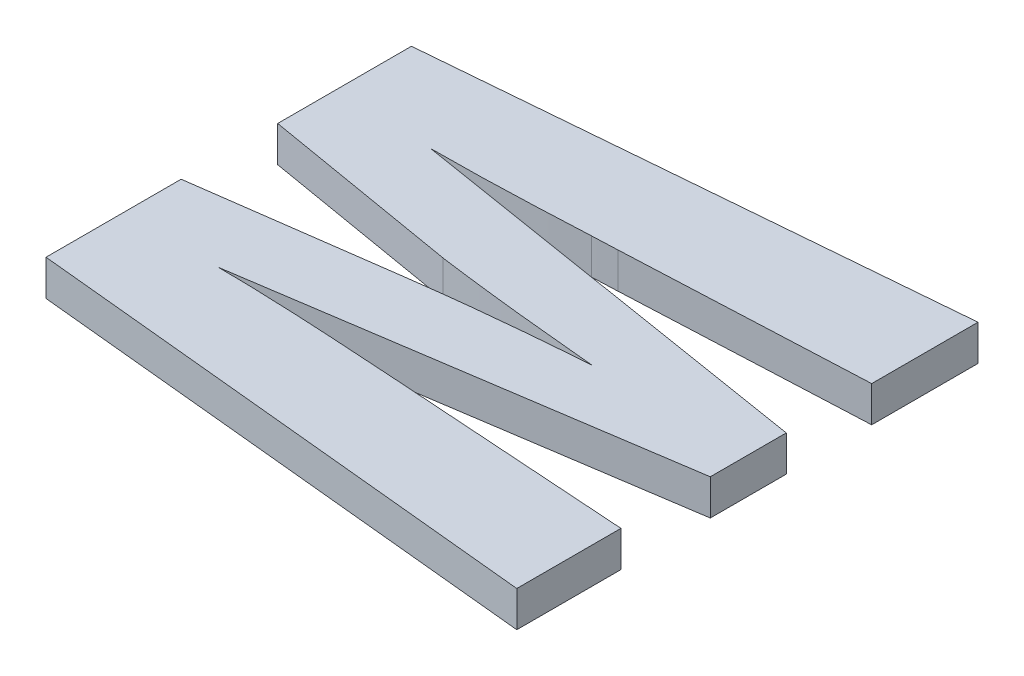
ISO-10303-21;
HEADER;
FILE_DESCRIPTION(('STEP AP214'),'2;1');
FILE_NAME('part.step','',(''),(''),'','','');
FILE_SCHEMA(('AUTOMOTIVE_DESIGN { 1 0 10303 214 1 1 1 1 }'));
ENDSEC;
DATA;
#1=APPLICATION_CONTEXT('core data for automotive mechanical design processes');
#2=APPLICATION_PROTOCOL_DEFINITION('international standard','automotive_design',2000,#1);
#3=PRODUCT_CONTEXT('',#1,'mechanical');
#4=PRODUCT('Part','Part','',(#3));
#5=PRODUCT_RELATED_PRODUCT_CATEGORY('part','',(#4));
#6=PRODUCT_DEFINITION_FORMATION('','',#4);
#7=PRODUCT_DEFINITION_CONTEXT('part definition',#1,'design');
#8=PRODUCT_DEFINITION('design','',#6,#7);
#9=PRODUCT_DEFINITION_SHAPE('','',#8);
#10=(LENGTH_UNIT() NAMED_UNIT(*) SI_UNIT(.MILLI.,.METRE.));
#11=(NAMED_UNIT(*) PLANE_ANGLE_UNIT() SI_UNIT($,.RADIAN.));
#12=(NAMED_UNIT(*) SI_UNIT($,.STERADIAN.) SOLID_ANGLE_UNIT());
#13=UNCERTAINTY_MEASURE_WITH_UNIT(LENGTH_MEASURE(1.E-05),#10,'distance_accuracy_value','');
#14=(GEOMETRIC_REPRESENTATION_CONTEXT(3) GLOBAL_UNCERTAINTY_ASSIGNED_CONTEXT((#13)) GLOBAL_UNIT_ASSIGNED_CONTEXT((#10,
#11,#12)) REPRESENTATION_CONTEXT('',''));
#15=CARTESIAN_POINT('',(0.,0.,0.));
#16=DIRECTION('',(0.,0.,1.));
#17=DIRECTION('',(1.,0.,0.));
#18=AXIS2_PLACEMENT_3D('',#15,#16,#17);
#19=CARTESIAN_POINT('',(2.55,2.9956,-0.67430397727273));
#20=DIRECTION('',(1.,0.,0.));
#21=DIRECTION('',(0.,-1.,0.));
#22=AXIS2_PLACEMENT_3D('',#19,#20,#21);
#23=PLANE('',#22);
#24=DIRECTION('',(0.,0.,1.));
#25=VECTOR('',#24,1.);
#26=CARTESIAN_POINT('',(2.55,2.9306,-0.67430397727273));
#27=LINE('',#26,#25);
#28=CARTESIAN_POINT('',(2.55,2.9306,-0.67430397727273));
#29=VERTEX_POINT('',#28);
#30=CARTESIAN_POINT('',(2.55,2.9306,-0.484805194805197));
#31=VERTEX_POINT('',#30);
#32=EDGE_CURVE('E11',#29,#31,#27,.T.);
#33=ORIENTED_EDGE('',*,*,#32,.F.);
#34=DIRECTION('',(0.,-1.,0.));
#35=VECTOR('',#34,1.);
#36=CARTESIAN_POINT('',(2.55,2.9956,-0.67430397727273));
#37=LINE('',#36,#35);
#38=CARTESIAN_POINT('',(2.55,2.9956,-0.67430397727273));
#39=VERTEX_POINT('',#38);
#40=EDGE_CURVE('E24',#39,#29,#37,.T.);
#41=ORIENTED_EDGE('',*,*,#40,.F.);
#42=DIRECTION('',(0.,0.,1.));
#43=VECTOR('',#42,1.);
#44=CARTESIAN_POINT('',(2.55,2.9956,-0.67430397727273));
#45=LINE('',#44,#43);
#46=CARTESIAN_POINT('',(2.55,2.9956,-0.484805194805197));
#47=VERTEX_POINT('',#46);
#48=EDGE_CURVE('E374',#39,#47,#45,.T.);
#49=ORIENTED_EDGE('',*,*,#48,.T.);
#50=DIRECTION('',(0.,-1.,0.));
#51=VECTOR('',#50,1.);
#52=CARTESIAN_POINT('',(2.55,2.9956,-0.484805194805197));
#53=LINE('',#52,#51);
#54=EDGE_CURVE('E168',#47,#31,#53,.T.);
#55=ORIENTED_EDGE('',*,*,#54,.T.);
#56=EDGE_LOOP('',(#33,#41,#49,#55));
#57=FACE_BOUND('',#56,.T.);
#58=ADVANCED_FACE('F17',(#57),#23,.T.);
#59=CARTESIAN_POINT('',(2.1114346590909,2.9956,-0.703798701298704));
#60=DIRECTION('',(0.0671011714329746,0.,-0.997746176536058));
#61=DIRECTION('',(-0.997746176536058,0.,-0.0671011714329746));
#62=AXIS2_PLACEMENT_3D('',#59,#60,#61);
#63=PLANE('',#62);
#64=DIRECTION('',(0.997746176536058,0.,0.0671011714329746));
#65=VECTOR('',#64,1.);
#66=CARTESIAN_POINT('',(2.1114346590909,2.9306,-0.703798701298704));
#67=LINE('',#66,#65);
#68=CARTESIAN_POINT('',(2.1114346590909,2.9306,-0.703798701298704));
#69=VERTEX_POINT('',#68);
#70=EDGE_CURVE('E371',#69,#29,#67,.T.);
#71=ORIENTED_EDGE('',*,*,#70,.F.);
#72=DIRECTION('',(0.,-1.,0.));
#73=VECTOR('',#72,1.);
#74=CARTESIAN_POINT('',(2.1114346590909,2.9956,-0.703798701298704));
#75=LINE('',#74,#73);
#76=CARTESIAN_POINT('',(2.1114346590909,2.9956,-0.703798701298704));
#77=VERTEX_POINT('',#76);
#78=EDGE_CURVE('E368',#77,#69,#75,.T.);
#79=ORIENTED_EDGE('',*,*,#78,.F.);
#80=DIRECTION('',(0.997746176536058,0.,0.0671011714329746));
#81=VECTOR('',#80,1.);
#82=CARTESIAN_POINT('',(2.1114346590909,2.9956,-0.703798701298704));
#83=LINE('',#82,#81);
#84=EDGE_CURVE('E362',#77,#39,#83,.T.);
#85=ORIENTED_EDGE('',*,*,#84,.T.);
#86=ORIENTED_EDGE('',*,*,#40,.T.);
#87=EDGE_LOOP('',(#71,#79,#85,#86));
#88=FACE_BOUND('',#87,.T.);
#89=ADVANCED_FACE('F376',(#88),#63,.T.);
#90=CARTESIAN_POINT('',(2.0503246753247,2.9956,-0.707654220779223));
#91=CARTESIAN_POINT('',(2.0503246753247,2.9306,-0.707654220779223));
#92=CARTESIAN_POINT('',(2.0566856654104,2.9956,-0.707258651402865));
#93=CARTESIAN_POINT('',(2.0566856654104,2.9306,-0.707258651402865));
#94=CARTESIAN_POINT('',(2.0685715577482,2.9956,-0.706519506245245));
#95=CARTESIAN_POINT('',(2.0685715577482,2.9306,-0.706519506245245));
#96=CARTESIAN_POINT('',(2.0851592709975,2.9956,-0.705634886613643));
#97=CARTESIAN_POINT('',(2.0851592709975,2.9306,-0.705634886613643));
#98=CARTESIAN_POINT('',(2.0991603994439,2.9956,-0.704620922676409));
#99=CARTESIAN_POINT('',(2.0991603994439,2.9306,-0.704620922676409));
#100=CARTESIAN_POINT('',(2.1076432023254,2.9956,-0.704052681326414));
#101=CARTESIAN_POINT('',(2.1076432023254,2.9306,-0.704052681326414));
#102=CARTESIAN_POINT('',(2.1114346590909,2.9956,-0.703798701298704));
#103=CARTESIAN_POINT('',(2.1114346590909,2.9306,-0.703798701298704));
#104=B_SPLINE_SURFACE_WITH_KNOTS('',3,1,((#90,#91),(#92,#93),(#94,#95),(#96,#97),(#98,#99),
(#100,#101),(#102,#103)),.UNSPECIFIED.,.F.,.F.,.F.,(4,1,1,1,4),(2,2),(0.,0.31225201051119,
0.583461651282309,0.813824845111571,1.),(0.,1.),.UNSPECIFIED.);
#105=CARTESIAN_POINT('',(2.0503246753247,2.9306,-0.707654220779223));
#106=CARTESIAN_POINT('',(2.0566856654104,2.9306,-0.707258651402865));
#107=CARTESIAN_POINT('',(2.0685715577482,2.9306,-0.706519506245245));
#108=CARTESIAN_POINT('',(2.0851592709975,2.9306,-0.705634886613643));
#109=CARTESIAN_POINT('',(2.0991603994439,2.9306,-0.704620922676409));
#110=CARTESIAN_POINT('',(2.1076432023254,2.9306,-0.704052681326414));
#111=CARTESIAN_POINT('',(2.1114346590909,2.9306,-0.703798701298704));
#112=B_SPLINE_CURVE_WITH_KNOTS('',3,(#105,#106,#107,#108,#109,#110,#111),.UNSPECIFIED.,.F.,.F.,
(4,1,1,1,4),(0.,0.31225201051119,0.583461651282309,0.813824845111571,1.),.UNSPECIFIED.);
#113=CARTESIAN_POINT('',(2.0503246753247,2.9306,-0.707654220779223));
#114=VERTEX_POINT('',#113);
#115=EDGE_CURVE('E357',#114,#69,#112,.T.);
#116=DIRECTION('',(0.,-1.,0.));
#117=VECTOR('',#116,1.);
#118=CARTESIAN_POINT('',(2.0503246753247,2.9956,-0.707654220779223));
#119=LINE('',#118,#117);
#120=CARTESIAN_POINT('',(2.0503246753247,2.9956,-0.707654220779223));
#121=VERTEX_POINT('',#120);
#122=EDGE_CURVE('E351',#121,#114,#119,.T.);
#123=CARTESIAN_POINT('',(2.0503246753247,2.9956,-0.707654220779223));
#124=CARTESIAN_POINT('',(2.0566856654104,2.9956,-0.707258651402865));
#125=CARTESIAN_POINT('',(2.0685715577482,2.9956,-0.706519506245245));
#126=CARTESIAN_POINT('',(2.0851592709975,2.9956,-0.705634886613643));
#127=CARTESIAN_POINT('',(2.0991603994439,2.9956,-0.704620922676409));
#128=CARTESIAN_POINT('',(2.1076432023254,2.9956,-0.704052681326414));
#129=CARTESIAN_POINT('',(2.1114346590909,2.9956,-0.703798701298704));
#130=B_SPLINE_CURVE_WITH_KNOTS('',3,(#123,#124,#125,#126,#127,#128,#129),.UNSPECIFIED.,.F.,.F.,
(4,1,1,1,4),(0.,0.31225201051119,0.583461651282309,0.813824845111571,1.),.UNSPECIFIED.);
#131=EDGE_CURVE('E343',#121,#77,#130,.T.);
#132=ORIENTED_EDGE('',*,*,#115,.F.);
#133=ORIENTED_EDGE('',*,*,#122,.F.);
#134=ORIENTED_EDGE('',*,*,#131,.T.);
#135=ORIENTED_EDGE('',*,*,#78,.T.);
#136=EDGE_LOOP('',(#132,#133,#134,#135));
#137=FACE_BOUND('',#136,.T.);
#138=ADVANCED_FACE('F380',(#137),#104,.T.);
#139=CARTESIAN_POINT('',(1.7731128246753,2.9956,-0.719413555194808));
#140=CARTESIAN_POINT('',(1.7731128246753,2.9306,-0.719413555194808));
#141=CARTESIAN_POINT('',(1.7816594609686,2.9956,-0.719371598065855));
#142=CARTESIAN_POINT('',(1.7816594609686,2.9306,-0.719371598065855));
#143=CARTESIAN_POINT('',(1.7995898342396,2.9956,-0.719283574315028));
#144=CARTESIAN_POINT('',(1.7995898342396,2.9306,-0.719283574315028));
#145=CARTESIAN_POINT('',(1.8277375091612,2.9956,-0.718683016275758));
#146=CARTESIAN_POINT('',(1.8277375091612,2.9306,-0.718683016275758));
#147=CARTESIAN_POINT('',(1.8584485208218,2.9956,-0.717627565305935));
#148=CARTESIAN_POINT('',(1.8584485208218,2.9306,-0.717627565305935));
#149=CARTESIAN_POINT('',(1.8918106026368,2.9956,-0.716617921873945));
#150=CARTESIAN_POINT('',(1.8918106026368,2.9306,-0.716617921873945));
#151=CARTESIAN_POINT('',(1.9277822376738,2.9956,-0.714696182107604));
#152=CARTESIAN_POINT('',(1.9277822376738,2.9306,-0.714696182107604));
#153=CARTESIAN_POINT('',(1.9663537889663,2.9956,-0.712942317403401));
#154=CARTESIAN_POINT('',(1.9663537889663,2.9306,-0.712942317403401));
#155=CARTESIAN_POINT('',(2.0074630955872,2.9956,-0.710267471488408));
#156=CARTESIAN_POINT('',(2.0074630955872,2.9306,-0.710267471488408));
#157=CARTESIAN_POINT('',(2.0357374184111,2.9956,-0.708543599092109));
#158=CARTESIAN_POINT('',(2.0357374184111,2.9306,-0.708543599092109));
#159=CARTESIAN_POINT('',(2.0503246753247,2.9956,-0.707654220779223));
#160=CARTESIAN_POINT('',(2.0503246753247,2.9306,-0.707654220779223));
#161=B_SPLINE_SURFACE_WITH_KNOTS('',3,1,((#139,#140),(#141,#142),(#143,#144),(#145,#146),(#147,
#148),(#149,#150),(#151,#152),(#153,#154),(#155,#156),(#157,#158),(#159,#160)),.UNSPECIFIED.,
.F.,.F.,.F.,(4,1,1,1,1,1,1,1,4),(2,2),(0.,0.0923950886621478,0.193839818528261,
0.304348582638287,0.424600528071903,0.554656105384144,0.693765722863727,0.842007955268638,1.),
(0.,1.),.UNSPECIFIED.);
#162=CARTESIAN_POINT('',(1.7731128246753,2.9306,-0.719413555194808));
#163=CARTESIAN_POINT('',(1.7816594609686,2.9306,-0.719371598065855));
#164=CARTESIAN_POINT('',(1.7995898342396,2.9306,-0.719283574315028));
#165=CARTESIAN_POINT('',(1.8277375091612,2.9306,-0.718683016275758));
#166=CARTESIAN_POINT('',(1.8584485208218,2.9306,-0.717627565305935));
#167=CARTESIAN_POINT('',(1.8918106026368,2.9306,-0.716617921873945));
#168=CARTESIAN_POINT('',(1.9277822376738,2.9306,-0.714696182107604));
#169=CARTESIAN_POINT('',(1.9663537889663,2.9306,-0.712942317403401));
#170=CARTESIAN_POINT('',(2.0074630955872,2.9306,-0.710267471488408));
#171=CARTESIAN_POINT('',(2.0357374184111,2.9306,-0.708543599092109));
#172=CARTESIAN_POINT('',(2.0503246753247,2.9306,-0.707654220779223));
#173=B_SPLINE_CURVE_WITH_KNOTS('',3,(#162,#163,#164,#165,#166,#167,#168,#169,#170,#171,#172),
.UNSPECIFIED.,.F.,.F.,(4,1,1,1,1,1,1,1,4),(0.,0.0923950886621478,0.193839818528261,
0.304348582638287,0.424600528071903,0.554656105384144,0.693765722863727,0.842007955268638,1.),.UNSPECIFIED.);
#174=CARTESIAN_POINT('',(1.7731128246753,2.9306,-0.719413555194808));
#175=VERTEX_POINT('',#174);
#176=EDGE_CURVE('E338',#175,#114,#173,.T.);
#177=DIRECTION('',(0.,-1.,0.));
#178=VECTOR('',#177,1.);
#179=CARTESIAN_POINT('',(1.7731128246753,2.9956,-0.719413555194808));
#180=LINE('',#179,#178);
#181=CARTESIAN_POINT('',(1.7731128246753,2.9956,-0.719413555194808));
#182=VERTEX_POINT('',#181);
#183=EDGE_CURVE('E332',#182,#175,#180,.T.);
#184=CARTESIAN_POINT('',(1.7731128246753,2.9956,-0.719413555194808));
#185=CARTESIAN_POINT('',(1.7816594609686,2.9956,-0.719371598065855));
#186=CARTESIAN_POINT('',(1.7995898342396,2.9956,-0.719283574315028));
#187=CARTESIAN_POINT('',(1.8277375091612,2.9956,-0.718683016275758));
#188=CARTESIAN_POINT('',(1.8584485208218,2.9956,-0.717627565305935));
#189=CARTESIAN_POINT('',(1.8918106026368,2.9956,-0.716617921873945));
#190=CARTESIAN_POINT('',(1.9277822376738,2.9956,-0.714696182107604));
#191=CARTESIAN_POINT('',(1.9663537889663,2.9956,-0.712942317403401));
#192=CARTESIAN_POINT('',(2.0074630955872,2.9956,-0.710267471488408));
#193=CARTESIAN_POINT('',(2.0357374184111,2.9956,-0.708543599092109));
#194=CARTESIAN_POINT('',(2.0503246753247,2.9956,-0.707654220779223));
#195=B_SPLINE_CURVE_WITH_KNOTS('',3,(#184,#185,#186,#187,#188,#189,#190,#191,#192,#193,#194),
.UNSPECIFIED.,.F.,.F.,(4,1,1,1,1,1,1,1,4),(0.,0.0923950886621478,0.193839818528261,
0.304348582638287,0.424600528071903,0.554656105384144,0.693765722863727,0.842007955268638,1.),.UNSPECIFIED.);
#196=EDGE_CURVE('E327',#182,#121,#195,.T.);
#197=ORIENTED_EDGE('',*,*,#176,.F.);
#198=ORIENTED_EDGE('',*,*,#183,.F.);
#199=ORIENTED_EDGE('',*,*,#196,.T.);
#200=ORIENTED_EDGE('',*,*,#122,.T.);
#201=EDGE_LOOP('',(#197,#198,#199,#200));
#202=FACE_BOUND('',#201,.T.);
#203=ADVANCED_FACE('F383',(#202),#161,.T.);
#204=CARTESIAN_POINT('',(2.55,2.9956,-0.836814123376626));
#205=DIRECTION('',(0.149420158974291,0.,0.988773794197691));
#206=DIRECTION('',(0.988773794197691,0.,-0.149420158974291));
#207=AXIS2_PLACEMENT_3D('',#204,#205,#206);
#208=PLANE('',#207);
#209=DIRECTION('',(-0.988773794197691,0.,0.149420158974291));
#210=VECTOR('',#209,1.);
#211=CARTESIAN_POINT('',(2.55,2.9306,-0.836814123376626));
#212=LINE('',#211,#210);
#213=CARTESIAN_POINT('',(2.55,2.9306,-0.836814123376626));
#214=VERTEX_POINT('',#213);
#215=EDGE_CURVE('E324',#214,#175,#212,.T.);
#216=ORIENTED_EDGE('',*,*,#215,.F.);
#217=DIRECTION('',(0.,-1.,0.));
#218=VECTOR('',#217,1.);
#219=CARTESIAN_POINT('',(2.55,2.9956,-0.836814123376626));
#220=LINE('',#219,#218);
#221=CARTESIAN_POINT('',(2.55,2.9956,-0.836814123376626));
#222=VERTEX_POINT('',#221);
#223=EDGE_CURVE('E321',#222,#214,#220,.T.);
#224=ORIENTED_EDGE('',*,*,#223,.F.);
#225=DIRECTION('',(-0.988773794197691,0.,0.149420158974291));
#226=VECTOR('',#225,1.);
#227=CARTESIAN_POINT('',(2.55,2.9956,-0.836814123376626));
#228=LINE('',#227,#226);
#229=EDGE_CURVE('E318',#222,#182,#228,.T.);
#230=ORIENTED_EDGE('',*,*,#229,.T.);
#231=ORIENTED_EDGE('',*,*,#183,.T.);
#232=EDGE_LOOP('',(#216,#224,#230,#231));
#233=FACE_BOUND('',#232,.T.);
#234=ADVANCED_FACE('F388',(#233),#208,.T.);
#235=CARTESIAN_POINT('',(2.55,2.9956,-0.97503449675325));
#236=DIRECTION('',(1.,0.,0.));
#237=DIRECTION('',(0.,-1.,0.));
#238=AXIS2_PLACEMENT_3D('',#235,#236,#237);
#239=PLANE('',#238);
#240=DIRECTION('',(0.,0.,1.));
#241=VECTOR('',#240,1.);
#242=CARTESIAN_POINT('',(2.55,2.9306,-0.97503449675325));
#243=LINE('',#242,#241);
#244=CARTESIAN_POINT('',(2.55,2.9306,-0.97503449675325));
#245=VERTEX_POINT('',#244);
#246=EDGE_CURVE('E315',#245,#214,#243,.T.);
#247=ORIENTED_EDGE('',*,*,#246,.F.);
#248=DIRECTION('',(0.,-1.,0.));
#249=VECTOR('',#248,1.);
#250=CARTESIAN_POINT('',(2.55,2.9956,-0.97503449675325));
#251=LINE('',#250,#249);
#252=CARTESIAN_POINT('',(2.55,2.9956,-0.97503449675325));
#253=VERTEX_POINT('',#252);
#254=EDGE_CURVE('E312',#253,#245,#251,.T.);
#255=ORIENTED_EDGE('',*,*,#254,.F.);
#256=DIRECTION('',(0.,0.,1.));
#257=VECTOR('',#256,1.);
#258=CARTESIAN_POINT('',(2.55,2.9956,-0.97503449675325));
#259=LINE('',#258,#257);
#260=EDGE_CURVE('E309',#253,#222,#259,.T.);
#261=ORIENTED_EDGE('',*,*,#260,.T.);
#262=ORIENTED_EDGE('',*,*,#223,.T.);
#263=EDGE_LOOP('',(#247,#255,#261,#262));
#264=FACE_BOUND('',#263,.T.);
#265=ADVANCED_FACE('F390',(#264),#239,.T.);
#266=CARTESIAN_POINT('',(1.778317775974,2.9956,-1.099567775974));
#267=DIRECTION('',(0.159317730379367,0.,-0.987227360230037));
#268=DIRECTION('',(-0.987227360230037,0.,-0.159317730379367));
#269=AXIS2_PLACEMENT_3D('',#266,#267,#268);
#270=PLANE('',#269);
#271=DIRECTION('',(0.987227360230037,0.,0.159317730379367));
#272=VECTOR('',#271,1.);
#273=CARTESIAN_POINT('',(1.778317775974,2.9306,-1.099567775974));
#274=LINE('',#273,#272);
#275=CARTESIAN_POINT('',(1.778317775974,2.9306,-1.099567775974));
#276=VERTEX_POINT('',#275);
#277=EDGE_CURVE('E306',#276,#245,#274,.T.);
#278=ORIENTED_EDGE('',*,*,#277,.F.);
#279=DIRECTION('',(0.,-1.,0.));
#280=VECTOR('',#279,1.);
#281=CARTESIAN_POINT('',(1.778317775974,2.9956,-1.099567775974));
#282=LINE('',#281,#280);
#283=CARTESIAN_POINT('',(1.778317775974,2.9956,-1.099567775974));
#284=VERTEX_POINT('',#283);
#285=EDGE_CURVE('E303',#284,#276,#282,.T.);
#286=ORIENTED_EDGE('',*,*,#285,.F.);
#287=DIRECTION('',(0.987227360230037,0.,0.159317730379367));
#288=VECTOR('',#287,1.);
#289=CARTESIAN_POINT('',(1.778317775974,2.9956,-1.099567775974));
#290=LINE('',#289,#288);
#291=EDGE_CURVE('E297',#284,#253,#290,.T.);
#292=ORIENTED_EDGE('',*,*,#291,.T.);
#293=ORIENTED_EDGE('',*,*,#254,.T.);
#294=EDGE_LOOP('',(#278,#286,#292,#293));
#295=FACE_BOUND('',#294,.T.);
#296=ADVANCED_FACE('F392',(#295),#270,.T.);
#297=CARTESIAN_POINT('',(2.0620840097403,2.9956,-1.1082426948052));
#298=CARTESIAN_POINT('',(2.0620840097403,2.9306,-1.1082426948052));
#299=CARTESIAN_POINT('',(2.0480123266642,2.9956,-1.1075167139611));
#300=CARTESIAN_POINT('',(2.0480123266642,2.9306,-1.1075167139611));
#301=CARTESIAN_POINT('',(2.0204518672346,2.9956,-1.1060948253715));
#302=CARTESIAN_POINT('',(2.0204518672346,2.9306,-1.1060948253715));
#303=CARTESIAN_POINT('',(1.9800967897182,2.9956,-1.1043359943212));
#304=CARTESIAN_POINT('',(1.9800967897182,2.9306,-1.1043359943212));
#305=CARTESIAN_POINT('',(1.9416604154257,2.9956,-1.1031170049683));
#306=CARTESIAN_POINT('',(1.9416604154257,2.9306,-1.1031170049683));
#307=CARTESIAN_POINT('',(1.905234836157,2.9956,-1.1016341780414));
#308=CARTESIAN_POINT('',(1.905234836157,2.9306,-1.1016341780414));
#309=CARTESIAN_POINT('',(1.8707256046615,2.9956,-1.1006747731418));
#310=CARTESIAN_POINT('',(1.8707256046615,2.9306,-1.1006747731418));
#311=CARTESIAN_POINT('',(1.8382078872173,2.9956,-1.1001423103342));
#312=CARTESIAN_POINT('',(1.8382078872173,2.9306,-1.1001423103342));
#313=CARTESIAN_POINT('',(1.8076206702007,2.9956,-1.0997252944863));
#314=CARTESIAN_POINT('',(1.8076206702007,2.9306,-1.0997252944863));
#315=CARTESIAN_POINT('',(1.7878924341285,2.9956,-1.0996192448118));
#316=CARTESIAN_POINT('',(1.7878924341285,2.9306,-1.0996192448118));
#317=CARTESIAN_POINT('',(1.778317775974,2.9956,-1.099567775974));
#318=CARTESIAN_POINT('',(1.778317775974,2.9306,-1.099567775974));
#319=B_SPLINE_SURFACE_WITH_KNOTS('',3,1,((#297,#298),(#299,#300),(#301,#302),(#303,#304),(#305,
#306),(#307,#308),(#309,#310),(#311,#312),(#313,#314),(#315,#316),(#317,#318)),.UNSPECIFIED.,
.F.,.F.,.F.,(4,1,1,1,1,1,1,1,4),(2,2),(0.,0.148880380340194,0.291593525810425,0.426790758847534,
0.555202778810434,0.676784588021821,0.791547438771983,0.898832211461524,1.),(0.,1.),.UNSPECIFIED.);
#320=CARTESIAN_POINT('',(2.0620840097403,2.9306,-1.1082426948052));
#321=CARTESIAN_POINT('',(2.0480123266642,2.9306,-1.1075167139611));
#322=CARTESIAN_POINT('',(2.0204518672346,2.9306,-1.1060948253715));
#323=CARTESIAN_POINT('',(1.9800967897182,2.9306,-1.1043359943212));
#324=CARTESIAN_POINT('',(1.9416604154257,2.9306,-1.1031170049683));
#325=CARTESIAN_POINT('',(1.905234836157,2.9306,-1.1016341780414));
#326=CARTESIAN_POINT('',(1.8707256046615,2.9306,-1.1006747731418));
#327=CARTESIAN_POINT('',(1.8382078872173,2.9306,-1.1001423103342));
#328=CARTESIAN_POINT('',(1.8076206702007,2.9306,-1.0997252944863));
#329=CARTESIAN_POINT('',(1.7878924341285,2.9306,-1.0996192448118));
#330=CARTESIAN_POINT('',(1.778317775974,2.9306,-1.099567775974));
#331=B_SPLINE_CURVE_WITH_KNOTS('',3,(#320,#321,#322,#323,#324,#325,#326,#327,#328,#329,#330),
.UNSPECIFIED.,.F.,.F.,(4,1,1,1,1,1,1,1,4),(0.,0.148880380340194,0.291593525810425,
0.426790758847534,0.555202778810434,0.676784588021821,0.791547438771983,0.898832211461524,1.),.UNSPECIFIED.);
#332=CARTESIAN_POINT('',(2.0620840097403,2.9306,-1.1082426948052));
#333=VERTEX_POINT('',#332);
#334=EDGE_CURVE('E292',#333,#276,#331,.T.);
#335=DIRECTION('',(0.,-1.,0.));
#336=VECTOR('',#335,1.);
#337=CARTESIAN_POINT('',(2.0620840097403,2.9956,-1.1082426948052));
#338=LINE('',#337,#336);
#339=CARTESIAN_POINT('',(2.0620840097403,2.9956,-1.1082426948052));
#340=VERTEX_POINT('',#339);
#341=EDGE_CURVE('E286',#340,#333,#338,.T.);
#342=CARTESIAN_POINT('',(2.0620840097403,2.9956,-1.1082426948052));
#343=CARTESIAN_POINT('',(2.0480123266642,2.9956,-1.1075167139611));
#344=CARTESIAN_POINT('',(2.0204518672346,2.9956,-1.1060948253715));
#345=CARTESIAN_POINT('',(1.9800967897182,2.9956,-1.1043359943212));
#346=CARTESIAN_POINT('',(1.9416604154257,2.9956,-1.1031170049683));
#347=CARTESIAN_POINT('',(1.905234836157,2.9956,-1.1016341780414));
#348=CARTESIAN_POINT('',(1.8707256046615,2.9956,-1.1006747731418));
#349=CARTESIAN_POINT('',(1.8382078872173,2.9956,-1.1001423103342));
#350=CARTESIAN_POINT('',(1.8076206702007,2.9956,-1.0997252944863));
#351=CARTESIAN_POINT('',(1.7878924341285,2.9956,-1.0996192448118));
#352=CARTESIAN_POINT('',(1.778317775974,2.9956,-1.099567775974));
#353=B_SPLINE_CURVE_WITH_KNOTS('',3,(#342,#343,#344,#345,#346,#347,#348,#349,#350,#351,#352),
.UNSPECIFIED.,.F.,.F.,(4,1,1,1,1,1,1,1,4),(0.,0.148880380340194,0.291593525810425,
0.426790758847534,0.555202778810434,0.676784588021821,0.791547438771983,0.898832211461524,1.),.UNSPECIFIED.);
#354=EDGE_CURVE('E278',#340,#284,#353,.T.);
#355=ORIENTED_EDGE('',*,*,#334,.F.);
#356=ORIENTED_EDGE('',*,*,#341,.F.);
#357=ORIENTED_EDGE('',*,*,#354,.T.);
#358=ORIENTED_EDGE('',*,*,#285,.T.);
#359=EDGE_LOOP('',(#355,#356,#357,#358));
#360=FACE_BOUND('',#359,.T.);
#361=ADVANCED_FACE('F395',(#360),#319,.T.);
#362=CARTESIAN_POINT('',(2.1089285714286,2.9956,-1.1101704545455));
#363=CARTESIAN_POINT('',(2.1089285714286,2.9306,-1.1101704545455));
#364=CARTESIAN_POINT('',(2.1059729528353,2.9956,-1.1100349861566));
#365=CARTESIAN_POINT('',(2.1059729528353,2.9306,-1.1100349861566));
#366=CARTESIAN_POINT('',(2.0994844443988,2.9956,-1.1097375906179));
#367=CARTESIAN_POINT('',(2.0994844443988,2.9306,-1.1097375906179));
#368=CARTESIAN_POINT('',(2.0887482072742,2.9956,-1.1094119995119));
#369=CARTESIAN_POINT('',(2.0887482072742,2.9306,-1.1094119995119));
#370=CARTESIAN_POINT('',(2.0760950157438,2.9956,-1.1087588330156));
#371=CARTESIAN_POINT('',(2.0760950157438,2.9306,-1.1087588330156));
#372=CARTESIAN_POINT('',(2.0669682057236,2.9956,-1.1084226190857));
#373=CARTESIAN_POINT('',(2.0669682057236,2.9306,-1.1084226190857));
#374=CARTESIAN_POINT('',(2.0620840097403,2.9956,-1.1082426948052));
#375=CARTESIAN_POINT('',(2.0620840097403,2.9306,-1.1082426948052));
#376=B_SPLINE_SURFACE_WITH_KNOTS('',3,1,((#362,#363),(#364,#365),(#366,#367),(#368,#369),(#370,
#371),(#372,#373),(#374,#375)),.UNSPECIFIED.,.F.,.F.,.F.,(4,1,1,1,4),(2,2),(0.,
0.189317867376636,0.415612008402144,0.687265816318514,1.),(0.,1.),.UNSPECIFIED.);
#377=CARTESIAN_POINT('',(2.1089285714286,2.9306,-1.1101704545455));
#378=CARTESIAN_POINT('',(2.1059729528353,2.9306,-1.1100349861566));
#379=CARTESIAN_POINT('',(2.0994844443988,2.9306,-1.1097375906179));
#380=CARTESIAN_POINT('',(2.0887482072742,2.9306,-1.1094119995119));
#381=CARTESIAN_POINT('',(2.0760950157438,2.9306,-1.1087588330156));
#382=CARTESIAN_POINT('',(2.0669682057236,2.9306,-1.1084226190857));
#383=CARTESIAN_POINT('',(2.0620840097403,2.9306,-1.1082426948052));
#384=B_SPLINE_CURVE_WITH_KNOTS('',3,(#377,#378,#379,#380,#381,#382,#383),.UNSPECIFIED.,.F.,.F.,
(4,1,1,1,4),(0.,0.189317867376636,0.415612008402144,0.687265816318514,1.),.UNSPECIFIED.);
#385=CARTESIAN_POINT('',(2.1089285714286,2.9306,-1.1101704545455));
#386=VERTEX_POINT('',#385);
#387=EDGE_CURVE('E273',#386,#333,#384,.T.);
#388=DIRECTION('',(0.,-1.,0.));
#389=VECTOR('',#388,1.);
#390=CARTESIAN_POINT('',(2.1089285714286,2.9956,-1.1101704545455));
#391=LINE('',#390,#389);
#392=CARTESIAN_POINT('',(2.1089285714286,2.9956,-1.1101704545455));
#393=VERTEX_POINT('',#392);
#394=EDGE_CURVE('E267',#393,#386,#391,.T.);
#395=CARTESIAN_POINT('',(2.1089285714286,2.9956,-1.1101704545455));
#396=CARTESIAN_POINT('',(2.1059729528353,2.9956,-1.1100349861566));
#397=CARTESIAN_POINT('',(2.0994844443988,2.9956,-1.1097375906179));
#398=CARTESIAN_POINT('',(2.0887482072742,2.9956,-1.1094119995119));
#399=CARTESIAN_POINT('',(2.0760950157438,2.9956,-1.1087588330156));
#400=CARTESIAN_POINT('',(2.0669682057236,2.9956,-1.1084226190857));
#401=CARTESIAN_POINT('',(2.0620840097403,2.9956,-1.1082426948052));
#402=B_SPLINE_CURVE_WITH_KNOTS('',3,(#395,#396,#397,#398,#399,#400,#401),.UNSPECIFIED.,.F.,.F.,
(4,1,1,1,4),(0.,0.189317867376636,0.415612008402144,0.687265816318514,1.),.UNSPECIFIED.);
#403=EDGE_CURVE('E262',#393,#340,#402,.T.);
#404=ORIENTED_EDGE('',*,*,#387,.F.);
#405=ORIENTED_EDGE('',*,*,#394,.F.);
#406=ORIENTED_EDGE('',*,*,#403,.T.);
#407=ORIENTED_EDGE('',*,*,#341,.T.);
#408=EDGE_LOOP('',(#404,#405,#406,#407));
#409=FACE_BOUND('',#408,.T.);
#410=ADVANCED_FACE('F400',(#409),#376,.T.);
#411=CARTESIAN_POINT('',(2.55,2.9956,-1.1304119318182));
#412=DIRECTION('',(0.0458433598132528,0.,0.99894864050212));
#413=DIRECTION('',(0.99894864050212,0.,-0.0458433598132528));
#414=AXIS2_PLACEMENT_3D('',#411,#412,#413);
#415=PLANE('',#414);
#416=DIRECTION('',(-0.99894864050212,0.,0.0458433598132528));
#417=VECTOR('',#416,1.);
#418=CARTESIAN_POINT('',(2.55,2.9306,-1.1304119318182));
#419=LINE('',#418,#417);
#420=CARTESIAN_POINT('',(2.55,2.9306,-1.1304119318182));
#421=VERTEX_POINT('',#420);
#422=EDGE_CURVE('E259',#421,#386,#419,.T.);
#423=ORIENTED_EDGE('',*,*,#422,.F.);
#424=DIRECTION('',(0.,-1.,0.));
#425=VECTOR('',#424,1.);
#426=CARTESIAN_POINT('',(2.55,2.9956,-1.1304119318182));
#427=LINE('',#426,#425);
#428=CARTESIAN_POINT('',(2.55,2.9956,-1.1304119318182));
#429=VERTEX_POINT('',#428);
#430=EDGE_CURVE('E256',#429,#421,#427,.T.);
#431=ORIENTED_EDGE('',*,*,#430,.F.);
#432=DIRECTION('',(-0.99894864050212,0.,0.0458433598132528));
#433=VECTOR('',#432,1.);
#434=CARTESIAN_POINT('',(2.55,2.9956,-1.1304119318182));
#435=LINE('',#434,#433);
#436=EDGE_CURVE('E253',#429,#393,#435,.T.);
#437=ORIENTED_EDGE('',*,*,#436,.T.);
#438=ORIENTED_EDGE('',*,*,#394,.T.);
#439=EDGE_LOOP('',(#423,#431,#437,#438));
#440=FACE_BOUND('',#439,.T.);
#441=ADVANCED_FACE('F402',(#440),#415,.T.);
#442=CARTESIAN_POINT('',(2.55,2.9956,-1.3237662337662));
#443=DIRECTION('',(1.,0.,0.));
#444=DIRECTION('',(0.,-1.,0.));
#445=AXIS2_PLACEMENT_3D('',#442,#443,#444);
#446=PLANE('',#445);
#447=DIRECTION('',(0.,0.,1.));
#448=VECTOR('',#447,1.);
#449=CARTESIAN_POINT('',(2.55,2.9306,-1.3237662337662));
#450=LINE('',#449,#448);
#451=CARTESIAN_POINT('',(2.55,2.9306,-1.3237662337662));
#452=VERTEX_POINT('',#451);
#453=EDGE_CURVE('E250',#452,#421,#450,.T.);
#454=ORIENTED_EDGE('',*,*,#453,.F.);
#455=DIRECTION('',(0.,-1.,0.));
#456=VECTOR('',#455,1.);
#457=CARTESIAN_POINT('',(2.55,2.9956,-1.3237662337662));
#458=LINE('',#457,#456);
#459=CARTESIAN_POINT('',(2.55,2.9956,-1.3237662337662));
#460=VERTEX_POINT('',#459);
#461=EDGE_CURVE('E247',#460,#452,#458,.T.);
#462=ORIENTED_EDGE('',*,*,#461,.F.);
#463=DIRECTION('',(0.,0.,1.));
#464=VECTOR('',#463,1.);
#465=CARTESIAN_POINT('',(2.55,2.9956,-1.3237662337662));
#466=LINE('',#465,#464);
#467=EDGE_CURVE('E244',#460,#429,#466,.T.);
#468=ORIENTED_EDGE('',*,*,#467,.T.);
#469=ORIENTED_EDGE('',*,*,#430,.T.);
#470=EDGE_LOOP('',(#454,#462,#468,#469));
#471=FACE_BOUND('',#470,.T.);
#472=ADVANCED_FACE('F404',(#471),#446,.T.);
#473=CARTESIAN_POINT('',(1.6,2.9956,-1.2431858766234));
#474=DIRECTION('',(-0.0845179339568708,0.,-0.996421958228371));
#475=DIRECTION('',(-0.996421958228371,0.,0.0845179339568708));
#476=AXIS2_PLACEMENT_3D('',#473,#474,#475);
#477=PLANE('',#476);
#478=DIRECTION('',(0.996421958228371,0.,-0.0845179339568709));
#479=VECTOR('',#478,1.);
#480=CARTESIAN_POINT('',(1.6,2.9306,-1.2431858766234));
#481=LINE('',#480,#479);
#482=CARTESIAN_POINT('',(1.6,2.9306,-1.2431858766234));
#483=VERTEX_POINT('',#482);
#484=EDGE_CURVE('E241',#483,#452,#481,.T.);
#485=ORIENTED_EDGE('',*,*,#484,.F.);
#486=DIRECTION('',(0.,-1.,0.));
#487=VECTOR('',#486,1.);
#488=CARTESIAN_POINT('',(1.6,2.9956,-1.2431858766234));
#489=LINE('',#488,#487);
#490=CARTESIAN_POINT('',(1.6,2.9956,-1.2431858766234));
#491=VERTEX_POINT('',#490);
#492=EDGE_CURVE('E238',#491,#483,#489,.T.);
#493=ORIENTED_EDGE('',*,*,#492,.F.);
#494=DIRECTION('',(0.996421958228371,0.,-0.0845179339568709));
#495=VECTOR('',#494,1.);
#496=CARTESIAN_POINT('',(1.6,2.9956,-1.2431858766234));
#497=LINE('',#496,#495);
#498=EDGE_CURVE('E235',#491,#460,#497,.T.);
#499=ORIENTED_EDGE('',*,*,#498,.T.);
#500=ORIENTED_EDGE('',*,*,#461,.T.);
#501=EDGE_LOOP('',(#485,#493,#499,#500));
#502=FACE_BOUND('',#501,.T.);
#503=ADVANCED_FACE('F407',(#502),#477,.T.);
#504=CARTESIAN_POINT('',(1.6,2.9956,-0.9999025974026));
#505=DIRECTION('',(-1.,0.,0.));
#506=DIRECTION('',(0.,1.,0.));
#507=AXIS2_PLACEMENT_3D('',#504,#505,#506);
#508=PLANE('',#507);
#509=DIRECTION('',(0.,0.,-1.));
#510=VECTOR('',#509,1.);
#511=CARTESIAN_POINT('',(1.6,2.9306,-0.9999025974026));
#512=LINE('',#511,#510);
#513=CARTESIAN_POINT('',(1.6,2.9306,-0.9999025974026));
#514=VERTEX_POINT('',#513);
#515=EDGE_CURVE('E232',#514,#483,#512,.T.);
#516=ORIENTED_EDGE('',*,*,#515,.F.);
#517=DIRECTION('',(0.,-1.,0.));
#518=VECTOR('',#517,1.);
#519=CARTESIAN_POINT('',(1.6,2.9956,-0.9999025974026));
#520=LINE('',#519,#518);
#521=CARTESIAN_POINT('',(1.6,2.9956,-0.9999025974026));
#522=VERTEX_POINT('',#521);
#523=EDGE_CURVE('E229',#522,#514,#520,.T.);
#524=ORIENTED_EDGE('',*,*,#523,.F.);
#525=DIRECTION('',(0.,0.,-1.));
#526=VECTOR('',#525,1.);
#527=CARTESIAN_POINT('',(1.6,2.9956,-0.9999025974026));
#528=LINE('',#527,#526);
#529=EDGE_CURVE('E226',#522,#491,#528,.T.);
#530=ORIENTED_EDGE('',*,*,#529,.T.);
#531=ORIENTED_EDGE('',*,*,#492,.T.);
#532=EDGE_LOOP('',(#516,#524,#530,#531));
#533=FACE_BOUND('',#532,.T.);
#534=ADVANCED_FACE('F412',(#533),#508,.T.);
#535=CARTESIAN_POINT('',(1.9624188311688,2.9956,-0.938407061688315));
#536=DIRECTION('',(-0.167289672456575,0.,0.985907787518372));
#537=DIRECTION('',(0.985907787518372,0.,0.167289672456575));
#538=AXIS2_PLACEMENT_3D('',#535,#536,#537);
#539=PLANE('',#538);
#540=DIRECTION('',(-0.985907787518372,0.,-0.167289672456575));
#541=VECTOR('',#540,1.);
#542=CARTESIAN_POINT('',(1.9624188311688,2.9306,-0.938407061688315));
#543=LINE('',#542,#541);
#544=CARTESIAN_POINT('',(1.9624188311688,2.9306,-0.938407061688315));
#545=VERTEX_POINT('',#544);
#546=EDGE_CURVE('E223',#545,#514,#543,.T.);
#547=ORIENTED_EDGE('',*,*,#546,.F.);
#548=DIRECTION('',(0.,-1.,0.));
#549=VECTOR('',#548,1.);
#550=CARTESIAN_POINT('',(1.9624188311688,2.9956,-0.938407061688315));
#551=LINE('',#550,#549);
#552=CARTESIAN_POINT('',(1.9624188311688,2.9956,-0.938407061688315));
#553=VERTEX_POINT('',#552);
#554=EDGE_CURVE('E220',#553,#545,#551,.T.);
#555=ORIENTED_EDGE('',*,*,#554,.F.);
#556=DIRECTION('',(-0.985907787518372,0.,-0.167289672456575));
#557=VECTOR('',#556,1.);
#558=CARTESIAN_POINT('',(1.9624188311688,2.9956,-0.938407061688315));
#559=LINE('',#558,#557);
#560=EDGE_CURVE('E214',#553,#522,#559,.T.);
#561=ORIENTED_EDGE('',*,*,#560,.T.);
#562=ORIENTED_EDGE('',*,*,#523,.T.);
#563=EDGE_LOOP('',(#547,#555,#561,#562));
#564=FACE_BOUND('',#563,.T.);
#565=ADVANCED_FACE('F414',(#564),#539,.T.);
#566=CARTESIAN_POINT('',(2.268161525974,2.9956,-0.904864042207795));
#567=CARTESIAN_POINT('',(2.268161525974,2.9306,-0.904864042207795));
#568=CARTESIAN_POINT('',(2.258009230289,2.9956,-0.90583410628816));
#569=CARTESIAN_POINT('',(2.258009230289,2.9306,-0.90583410628816));
#570=CARTESIAN_POINT('',(2.2382201210586,2.9956,-0.907724979509582));
#571=CARTESIAN_POINT('',(2.2382201210586,2.9306,-0.907724979509582));
#572=CARTESIAN_POINT('',(2.2092940674795,2.9956,-0.910384985135789));
#573=CARTESIAN_POINT('',(2.2092940674795,2.9306,-0.910384985135789));
#574=CARTESIAN_POINT('',(2.1820409651411,2.9956,-0.913017188891342));
#575=CARTESIAN_POINT('',(2.1820409651411,2.9306,-0.913017188891342));
#576=CARTESIAN_POINT('',(2.1564335082972,2.9956,-0.915900046392225));
#577=CARTESIAN_POINT('',(2.1564335082972,2.9306,-0.915900046392225));
#578=CARTESIAN_POINT('',(2.1324994414792,2.9956,-0.918044030598025));
#579=CARTESIAN_POINT('',(2.1324994414792,2.9306,-0.918044030598025));
#580=CARTESIAN_POINT('',(2.1102037932702,2.9956,-0.92038848566048));
#581=CARTESIAN_POINT('',(2.1102037932702,2.9306,-0.92038848566048));
#582=CARTESIAN_POINT('',(2.0895901059061,2.9956,-0.922757791705651));
#583=CARTESIAN_POINT('',(2.0895901059061,2.9306,-0.922757791705651));
#584=CARTESIAN_POINT('',(2.0650230321192,2.9956,-0.925409199876762));
#585=CARTESIAN_POINT('',(2.0650230321192,2.9306,-0.925409199876762));
#586=CARTESIAN_POINT('',(2.0376734559322,2.9956,-0.928832113676238));
#587=CARTESIAN_POINT('',(2.0376734559322,2.9306,-0.928832113676238));
#588=CARTESIAN_POINT('',(2.0084001471462,2.9956,-0.932144517498522));
#589=CARTESIAN_POINT('',(2.0084001471462,2.9306,-0.932144517498522));
#590=CARTESIAN_POINT('',(1.9838779910349,2.9956,-0.935492565480561));
#591=CARTESIAN_POINT('',(1.9838779910349,2.9306,-0.935492565480561));
#592=CARTESIAN_POINT('',(1.9690375171669,2.9956,-0.937508138554226));
#593=CARTESIAN_POINT('',(1.9690375171669,2.9306,-0.937508138554226));
#594=CARTESIAN_POINT('',(1.9624188311688,2.9956,-0.938407061688315));
#595=CARTESIAN_POINT('',(1.9624188311688,2.9306,-0.938407061688315));
#596=B_SPLINE_SURFACE_WITH_KNOTS('',3,1,((#566,#567),(#568,#569),(#570,#571),(#572,#573),(#574,
#575),(#576,#577),(#578,#579),(#580,#581),(#582,#583),(#584,#585),(#586,#587),(#588,#589),(#590,
#591),(#592,#593),(#594,#595)),.UNSPECIFIED.,.F.,.F.,.F.,(4,1,1,1,1,1,1,1,1,1,1,1,4),(2,2),(0.,
0.0994638869496659,0.193877501639922,0.283300422363723,0.36648885003525,0.445186550116532,
0.517648401416829,0.585125730178017,0.647550877387972,0.758632526806672,0.853934267806032,
0.934856310851618,1.),(0.,1.),.UNSPECIFIED.);
#597=CARTESIAN_POINT('',(2.268161525974,2.9306,-0.904864042207795));
#598=CARTESIAN_POINT('',(2.258009230289,2.9306,-0.90583410628816));
#599=CARTESIAN_POINT('',(2.2382201210586,2.9306,-0.907724979509582));
#600=CARTESIAN_POINT('',(2.2092940674795,2.9306,-0.910384985135789));
#601=CARTESIAN_POINT('',(2.1820409651411,2.9306,-0.913017188891342));
#602=CARTESIAN_POINT('',(2.1564335082972,2.9306,-0.915900046392225));
#603=CARTESIAN_POINT('',(2.1324994414792,2.9306,-0.918044030598025));
#604=CARTESIAN_POINT('',(2.1102037932702,2.9306,-0.92038848566048));
#605=CARTESIAN_POINT('',(2.0895901059061,2.9306,-0.922757791705651));
#606=CARTESIAN_POINT('',(2.0650230321192,2.9306,-0.925409199876762));
#607=CARTESIAN_POINT('',(2.0376734559322,2.9306,-0.928832113676238));
#608=CARTESIAN_POINT('',(2.0084001471462,2.9306,-0.932144517498522));
#609=CARTESIAN_POINT('',(1.9838779910349,2.9306,-0.935492565480561));
#610=CARTESIAN_POINT('',(1.9690375171669,2.9306,-0.937508138554226));
#611=CARTESIAN_POINT('',(1.9624188311688,2.9306,-0.938407061688315));
#612=B_SPLINE_CURVE_WITH_KNOTS('',3,(#597,#598,#599,#600,#601,#602,#603,#604,#605,#606,#607,
#608,#609,#610,#611),.UNSPECIFIED.,.F.,.F.,(4,1,1,1,1,1,1,1,1,1,1,1,4),(0.,0.0994638869496659,
0.193877501639922,0.283300422363723,0.36648885003525,0.445186550116532,0.517648401416829,
0.585125730178017,0.647550877387972,0.758632526806672,0.853934267806032,0.934856310851618,1.),.UNSPECIFIED.);
#613=CARTESIAN_POINT('',(2.268161525974,2.9306,-0.904864042207795));
#614=VERTEX_POINT('',#613);
#615=EDGE_CURVE('E209',#614,#545,#612,.T.);
#616=DIRECTION('',(0.,-1.,0.));
#617=VECTOR('',#616,1.);
#618=CARTESIAN_POINT('',(2.268161525974,2.9956,-0.904864042207795));
#619=LINE('',#618,#617);
#620=CARTESIAN_POINT('',(2.268161525974,2.9956,-0.904864042207795));
#621=VERTEX_POINT('',#620);
#622=EDGE_CURVE('E203',#621,#614,#619,.T.);
#623=CARTESIAN_POINT('',(2.268161525974,2.9956,-0.904864042207795));
#624=CARTESIAN_POINT('',(2.258009230289,2.9956,-0.90583410628816));
#625=CARTESIAN_POINT('',(2.2382201210586,2.9956,-0.907724979509582));
#626=CARTESIAN_POINT('',(2.2092940674795,2.9956,-0.910384985135789));
#627=CARTESIAN_POINT('',(2.1820409651411,2.9956,-0.913017188891342));
#628=CARTESIAN_POINT('',(2.1564335082972,2.9956,-0.915900046392225));
#629=CARTESIAN_POINT('',(2.1324994414792,2.9956,-0.918044030598025));
#630=CARTESIAN_POINT('',(2.1102037932702,2.9956,-0.92038848566048));
#631=CARTESIAN_POINT('',(2.0895901059061,2.9956,-0.922757791705651));
#632=CARTESIAN_POINT('',(2.0650230321192,2.9956,-0.925409199876762));
#633=CARTESIAN_POINT('',(2.0376734559322,2.9956,-0.928832113676238));
#634=CARTESIAN_POINT('',(2.0084001471462,2.9956,-0.932144517498522));
#635=CARTESIAN_POINT('',(1.9838779910349,2.9956,-0.935492565480561));
#636=CARTESIAN_POINT('',(1.9690375171669,2.9956,-0.937508138554226));
#637=CARTESIAN_POINT('',(1.9624188311688,2.9956,-0.938407061688315));
#638=B_SPLINE_CURVE_WITH_KNOTS('',3,(#623,#624,#625,#626,#627,#628,#629,#630,#631,#632,#633,
#634,#635,#636,#637),.UNSPECIFIED.,.F.,.F.,(4,1,1,1,1,1,1,1,1,1,1,1,4),(0.,0.0994638869496659,
0.193877501639922,0.283300422363723,0.36648885003525,0.445186550116532,0.517648401416829,
0.585125730178017,0.647550877387972,0.758632526806672,0.853934267806032,0.934856310851618,1.),.UNSPECIFIED.);
#639=EDGE_CURVE('E195',#621,#553,#638,.T.);
#640=ORIENTED_EDGE('',*,*,#615,.F.);
#641=ORIENTED_EDGE('',*,*,#622,.F.);
#642=ORIENTED_EDGE('',*,*,#639,.T.);
#643=ORIENTED_EDGE('',*,*,#554,.T.);
#644=EDGE_LOOP('',(#640,#641,#642,#643));
#645=FACE_BOUND('',#644,.T.);
#646=ADVANCED_FACE('F416',(#645),#596,.T.);
#647=CARTESIAN_POINT('',(1.9624188311688,2.9956,-0.874212662337665));
#648=CARTESIAN_POINT('',(1.9624188311688,2.9306,-0.874212662337665));
#649=CARTESIAN_POINT('',(1.9893937394807,2.9956,-0.877733335401926));
#650=CARTESIAN_POINT('',(1.9893937394807,2.9306,-0.877733335401926));
#651=CARTESIAN_POINT('',(2.0421304663395,2.9956,-0.88461635319024));
#652=CARTESIAN_POINT('',(2.0421304663395,2.9306,-0.88461635319024));
#653=CARTESIAN_POINT('',(2.1199226917776,2.9956,-0.892800576755791));
#654=CARTESIAN_POINT('',(2.1199226917776,2.9306,-0.892800576755791));
#655=CARTESIAN_POINT('',(2.1948552460769,2.9956,-0.899647741493929));
#656=CARTESIAN_POINT('',(2.1948552460769,2.9306,-0.899647741493929));
#657=CARTESIAN_POINT('',(2.243993907567,2.9956,-0.903144331900221));
#658=CARTESIAN_POINT('',(2.243993907567,2.9306,-0.903144331900221));
#659=CARTESIAN_POINT('',(2.268161525974,2.9956,-0.904864042207795));
#660=CARTESIAN_POINT('',(2.268161525974,2.9306,-0.904864042207795));
#661=B_SPLINE_SURFACE_WITH_KNOTS('',3,1,((#647,#648),(#649,#650),(#651,#652),(#653,#654),(#655,
#656),(#657,#658),(#659,#660)),.UNSPECIFIED.,.F.,.F.,.F.,(4,1,1,1,4),(2,2),(0.,
0.265537615409553,0.519133727264783,0.763497982406032,1.),(0.,1.),.UNSPECIFIED.);
#662=CARTESIAN_POINT('',(1.9624188311688,2.9306,-0.874212662337665));
#663=CARTESIAN_POINT('',(1.9893937394807,2.9306,-0.877733335401926));
#664=CARTESIAN_POINT('',(2.0421304663395,2.9306,-0.88461635319024));
#665=CARTESIAN_POINT('',(2.1199226917776,2.9306,-0.892800576755791));
#666=CARTESIAN_POINT('',(2.1948552460769,2.9306,-0.899647741493929));
#667=CARTESIAN_POINT('',(2.243993907567,2.9306,-0.903144331900221));
#668=CARTESIAN_POINT('',(2.268161525974,2.9306,-0.904864042207795));
#669=B_SPLINE_CURVE_WITH_KNOTS('',3,(#662,#663,#664,#665,#666,#667,#668),.UNSPECIFIED.,.F.,.F.,
(4,1,1,1,4),(0.,0.265537615409553,0.519133727264783,0.763497982406032,1.),.UNSPECIFIED.);
#670=CARTESIAN_POINT('',(1.9624188311688,2.9306,-0.874212662337665));
#671=VERTEX_POINT('',#670);
#672=EDGE_CURVE('E190',#671,#614,#669,.T.);
#673=DIRECTION('',(0.,-1.,0.));
#674=VECTOR('',#673,1.);
#675=CARTESIAN_POINT('',(1.9624188311688,2.9956,-0.874212662337665));
#676=LINE('',#675,#674);
#677=CARTESIAN_POINT('',(1.9624188311688,2.9956,-0.874212662337665));
#678=VERTEX_POINT('',#677);
#679=EDGE_CURVE('E184',#678,#671,#676,.T.);
#680=CARTESIAN_POINT('',(1.9624188311688,2.9956,-0.874212662337665));
#681=CARTESIAN_POINT('',(1.9893937394807,2.9956,-0.877733335401926));
#682=CARTESIAN_POINT('',(2.0421304663395,2.9956,-0.88461635319024));
#683=CARTESIAN_POINT('',(2.1199226917776,2.9956,-0.892800576755791));
#684=CARTESIAN_POINT('',(2.1948552460769,2.9956,-0.899647741493929));
#685=CARTESIAN_POINT('',(2.243993907567,2.9956,-0.903144331900221));
#686=CARTESIAN_POINT('',(2.268161525974,2.9956,-0.904864042207795));
#687=B_SPLINE_CURVE_WITH_KNOTS('',3,(#680,#681,#682,#683,#684,#685,#686),.UNSPECIFIED.,.F.,.F.,
(4,1,1,1,4),(0.,0.265537615409553,0.519133727264783,0.763497982406032,1.),.UNSPECIFIED.);
#688=EDGE_CURVE('E179',#678,#621,#687,.T.);
#689=ORIENTED_EDGE('',*,*,#672,.F.);
#690=ORIENTED_EDGE('',*,*,#679,.F.);
#691=ORIENTED_EDGE('',*,*,#688,.T.);
#692=ORIENTED_EDGE('',*,*,#622,.T.);
#693=EDGE_LOOP('',(#689,#690,#691,#692));
#694=FACE_BOUND('',#693,.T.);
#695=ADVANCED_FACE('F419',(#694),#661,.T.);
#696=CARTESIAN_POINT('',(1.6,2.9956,-0.824283685064938));
#697=DIRECTION('',(-0.136476916007107,0.,-0.990643251325718));
#698=DIRECTION('',(-0.990643251325718,0.,0.136476916007107));
#699=AXIS2_PLACEMENT_3D('',#696,#697,#698);
#700=PLANE('',#699);
#701=DIRECTION('',(0.990643251325718,0.,-0.136476916007107));
#702=VECTOR('',#701,1.);
#703=CARTESIAN_POINT('',(1.6,2.9306,-0.824283685064938));
#704=LINE('',#703,#702);
#705=CARTESIAN_POINT('',(1.6,2.9306,-0.824283685064938));
#706=VERTEX_POINT('',#705);
#707=EDGE_CURVE('E176',#706,#671,#704,.T.);
#708=ORIENTED_EDGE('',*,*,#707,.F.);
#709=DIRECTION('',(0.,-1.,0.));
#710=VECTOR('',#709,1.);
#711=CARTESIAN_POINT('',(1.6,2.9956,-0.824283685064938));
#712=LINE('',#711,#710);
#713=CARTESIAN_POINT('',(1.6,2.9956,-0.824283685064938));
#714=VERTEX_POINT('',#713);
#715=EDGE_CURVE('E174',#714,#706,#712,.T.);
#716=ORIENTED_EDGE('',*,*,#715,.F.);
#717=DIRECTION('',(0.990643251325718,0.,-0.136476916007107));
#718=VECTOR('',#717,1.);
#719=CARTESIAN_POINT('',(1.6,2.9956,-0.824283685064938));
#720=LINE('',#719,#718);
#721=EDGE_CURVE('E163',#714,#678,#720,.T.);
#722=ORIENTED_EDGE('',*,*,#721,.T.);
#723=ORIENTED_EDGE('',*,*,#679,.T.);
#724=EDGE_LOOP('',(#708,#716,#722,#723));
#725=FACE_BOUND('',#724,.T.);
#726=ADVANCED_FACE('F421',(#725),#700,.T.);
#727=CARTESIAN_POINT('',(1.6,2.9956,-0.578494318181821));
#728=DIRECTION('',(-1.,0.,0.));
#729=DIRECTION('',(0.,1.,0.));
#730=AXIS2_PLACEMENT_3D('',#727,#728,#729);
#731=PLANE('',#730);
#732=DIRECTION('',(0.,0.,-1.));
#733=VECTOR('',#732,1.);
#734=CARTESIAN_POINT('',(1.6,2.9306,-0.578494318181821));
#735=LINE('',#734,#733);
#736=CARTESIAN_POINT('',(1.6,2.9306,-0.578494318181821));
#737=VERTEX_POINT('',#736);
#738=EDGE_CURVE('E150',#737,#706,#735,.T.);
#739=ORIENTED_EDGE('',*,*,#738,.F.);
#740=DIRECTION('',(0.,-1.,0.));
#741=VECTOR('',#740,1.);
#742=CARTESIAN_POINT('',(1.6,2.9956,-0.578494318181821));
#743=LINE('',#742,#741);
#744=CARTESIAN_POINT('',(1.6,2.9956,-0.578494318181821));
#745=VERTEX_POINT('',#744);
#746=EDGE_CURVE('E144',#745,#737,#743,.T.);
#747=ORIENTED_EDGE('',*,*,#746,.F.);
#748=DIRECTION('',(0.,0.,-1.));
#749=VECTOR('',#748,1.);
#750=CARTESIAN_POINT('',(1.6,2.9956,-0.578494318181821));
#751=LINE('',#750,#749);
#752=EDGE_CURVE('E148',#745,#714,#751,.T.);
#753=ORIENTED_EDGE('',*,*,#752,.T.);
#754=ORIENTED_EDGE('',*,*,#715,.T.);
#755=EDGE_LOOP('',(#739,#747,#753,#754));
#756=FACE_BOUND('',#755,.T.);
#757=ADVANCED_FACE('F146',(#756),#731,.T.);
#758=CARTESIAN_POINT('',(2.55,2.9956,-0.484805194805197));
#759=DIRECTION('',(-0.0981440138317152,0.,0.99517222255698));
#760=DIRECTION('',(0.99517222255698,0.,0.0981440138317152));
#761=AXIS2_PLACEMENT_3D('',#758,#759,#760);
#762=PLANE('',#761);
#763=DIRECTION('',(-0.99517222255698,0.,-0.0981440138317152));
#764=VECTOR('',#763,1.);
#765=CARTESIAN_POINT('',(2.55,2.9306,-0.484805194805197));
#766=LINE('',#765,#764);
#767=EDGE_CURVE('E164',#31,#737,#766,.T.);
#768=ORIENTED_EDGE('',*,*,#767,.F.);
#769=ORIENTED_EDGE('',*,*,#54,.F.);
#770=DIRECTION('',(-0.99517222255698,0.,-0.0981440138317152));
#771=VECTOR('',#770,1.);
#772=CARTESIAN_POINT('',(2.55,2.9956,-0.484805194805197));
#773=LINE('',#772,#771);
#774=EDGE_CURVE('E160',#47,#745,#773,.T.);
#775=ORIENTED_EDGE('',*,*,#774,.T.);
#776=ORIENTED_EDGE('',*,*,#746,.T.);
#777=EDGE_LOOP('',(#768,#769,#775,#776));
#778=FACE_BOUND('',#777,.T.);
#779=ADVANCED_FACE('F167',(#778),#762,.T.);
#780=CARTESIAN_POINT('',(2.1150284943698,2.9956,-0.892141541661933));
#781=DIRECTION('',(0.,1.,-2.20259693915985E-13));
#782=DIRECTION('',(0.,2.20259693915985E-13,1.));
#783=AXIS2_PLACEMENT_3D('',#780,#781,#782);
#784=PLANE('',#783);
#785=ORIENTED_EDGE('',*,*,#48,.F.);
#786=ORIENTED_EDGE('',*,*,#84,.F.);
#787=ORIENTED_EDGE('',*,*,#131,.F.);
#788=ORIENTED_EDGE('',*,*,#196,.F.);
#789=ORIENTED_EDGE('',*,*,#229,.F.);
#790=ORIENTED_EDGE('',*,*,#260,.F.);
#791=ORIENTED_EDGE('',*,*,#291,.F.);
#792=ORIENTED_EDGE('',*,*,#354,.F.);
#793=ORIENTED_EDGE('',*,*,#403,.F.);
#794=ORIENTED_EDGE('',*,*,#436,.F.);
#795=ORIENTED_EDGE('',*,*,#467,.F.);
#796=ORIENTED_EDGE('',*,*,#498,.F.);
#797=ORIENTED_EDGE('',*,*,#529,.F.);
#798=ORIENTED_EDGE('',*,*,#560,.F.);
#799=ORIENTED_EDGE('',*,*,#639,.F.);
#800=ORIENTED_EDGE('',*,*,#688,.F.);
#801=ORIENTED_EDGE('',*,*,#721,.F.);
#802=ORIENTED_EDGE('',*,*,#752,.F.);
#803=ORIENTED_EDGE('',*,*,#774,.F.);
#804=EDGE_LOOP('',(#785,#786,#787,#788,#789,#790,#791,#792,#793,#794,#795,#796,#797,#798,#799,
#800,#801,#802,#803));
#805=FACE_BOUND('',#804,.T.);
#806=ADVANCED_FACE('F159',(#805),#784,.T.);
#807=CARTESIAN_POINT('',(2.1150284943698,2.9306,-0.892141541661933));
#808=DIRECTION('',(0.,1.,-2.20259693915985E-13));
#809=DIRECTION('',(0.,2.20259693915985E-13,1.));
#810=AXIS2_PLACEMENT_3D('',#807,#808,#809);
#811=PLANE('',#810);
#812=ORIENTED_EDGE('',*,*,#32,.T.);
#813=ORIENTED_EDGE('',*,*,#767,.T.);
#814=ORIENTED_EDGE('',*,*,#738,.T.);
#815=ORIENTED_EDGE('',*,*,#707,.T.);
#816=ORIENTED_EDGE('',*,*,#672,.T.);
#817=ORIENTED_EDGE('',*,*,#615,.T.);
#818=ORIENTED_EDGE('',*,*,#546,.T.);
#819=ORIENTED_EDGE('',*,*,#515,.T.);
#820=ORIENTED_EDGE('',*,*,#484,.T.);
#821=ORIENTED_EDGE('',*,*,#453,.T.);
#822=ORIENTED_EDGE('',*,*,#422,.T.);
#823=ORIENTED_EDGE('',*,*,#387,.T.);
#824=ORIENTED_EDGE('',*,*,#334,.T.);
#825=ORIENTED_EDGE('',*,*,#277,.T.);
#826=ORIENTED_EDGE('',*,*,#246,.T.);
#827=ORIENTED_EDGE('',*,*,#215,.T.);
#828=ORIENTED_EDGE('',*,*,#176,.T.);
#829=ORIENTED_EDGE('',*,*,#115,.T.);
#830=ORIENTED_EDGE('',*,*,#70,.T.);
#831=EDGE_LOOP('',(#812,#813,#814,#815,#816,#817,#818,#819,#820,#821,#822,#823,#824,#825,#826,
#827,#828,#829,#830));
#832=FACE_BOUND('',#831,.T.);
#833=ADVANCED_FACE('F378',(#832),#811,.F.);
#834=CLOSED_SHELL('',(#58,#89,#138,#203,#234,#265,#296,#361,#410,#441,#472,#503,#534,#565,#646,
#695,#726,#757,#779,#806,#833));
#835=MANIFOLD_SOLID_BREP('B1',#834);
#836=ADVANCED_BREP_SHAPE_REPRESENTATION('',(#18,#835),#14);
#837=SHAPE_DEFINITION_REPRESENTATION(#9,#836);
ENDSEC;
END-ISO-10303-21;
